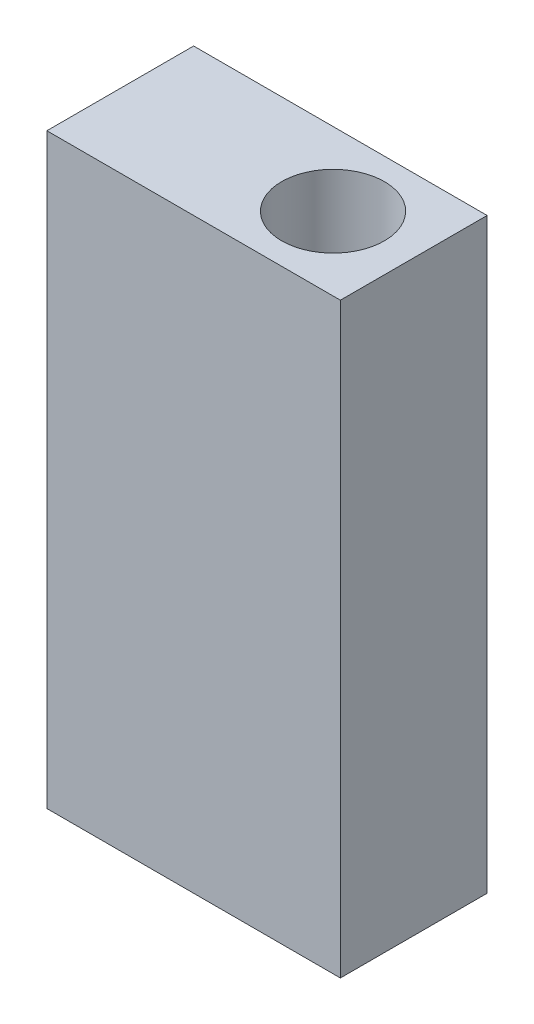
ISO-10303-21;
HEADER;
FILE_DESCRIPTION(('STEP AP214'),'2;1');
FILE_NAME('part.step','',(''),(''),'','','');
FILE_SCHEMA(('AUTOMOTIVE_DESIGN { 1 0 10303 214 1 1 1 1 }'));
ENDSEC;
DATA;
#1=APPLICATION_CONTEXT('core data for automotive mechanical design processes');
#2=APPLICATION_PROTOCOL_DEFINITION('international standard','automotive_design',2000,#1);
#3=PRODUCT_CONTEXT('',#1,'mechanical');
#4=PRODUCT('Part','Part','',(#3));
#5=PRODUCT_RELATED_PRODUCT_CATEGORY('part','',(#4));
#6=PRODUCT_DEFINITION_FORMATION('','',#4);
#7=PRODUCT_DEFINITION_CONTEXT('part definition',#1,'design');
#8=PRODUCT_DEFINITION('design','',#6,#7);
#9=PRODUCT_DEFINITION_SHAPE('','',#8);
#10=(LENGTH_UNIT() NAMED_UNIT(*) SI_UNIT(.MILLI.,.METRE.));
#11=(NAMED_UNIT(*) PLANE_ANGLE_UNIT() SI_UNIT($,.RADIAN.));
#12=(NAMED_UNIT(*) SI_UNIT($,.STERADIAN.) SOLID_ANGLE_UNIT());
#13=UNCERTAINTY_MEASURE_WITH_UNIT(LENGTH_MEASURE(1.E-05),#10,'distance_accuracy_value','');
#14=(GEOMETRIC_REPRESENTATION_CONTEXT(3) GLOBAL_UNCERTAINTY_ASSIGNED_CONTEXT((#13)) GLOBAL_UNIT_ASSIGNED_CONTEXT((#10,
#11,#12)) REPRESENTATION_CONTEXT('',''));
#15=CARTESIAN_POINT('',(0.,0.,0.));
#16=DIRECTION('',(0.,0.,1.));
#17=DIRECTION('',(1.,0.,0.));
#18=AXIS2_PLACEMENT_3D('',#15,#16,#17);
#19=CARTESIAN_POINT('',(0.,40.,0.));
#20=DIRECTION('',(0.,-1.,0.));
#21=DIRECTION('',(0.,0.,-1.));
#22=AXIS2_PLACEMENT_3D('',#19,#20,#21);
#23=PLANE('',#22);
#24=DIRECTION('',(0.,0.,1.));
#25=VECTOR('',#24,1.);
#26=CARTESIAN_POINT('',(-10.,40.,-5.));
#27=LINE('',#26,#25);
#28=CARTESIAN_POINT('',(-10.,40.,-5.));
#29=VERTEX_POINT('',#28);
#30=CARTESIAN_POINT('',(-10.,40.,5.));
#31=VERTEX_POINT('',#30);
#32=EDGE_CURVE('E86',#29,#31,#27,.T.);
#33=ORIENTED_EDGE('',*,*,#32,.T.);
#34=DIRECTION('',(1.,0.,0.));
#35=VECTOR('',#34,1.);
#36=CARTESIAN_POINT('',(10.,40.,5.));
#37=LINE('',#36,#35);
#38=CARTESIAN_POINT('',(10.,40.,5.));
#39=VERTEX_POINT('',#38);
#40=EDGE_CURVE('E81',#31,#39,#37,.T.);
#41=ORIENTED_EDGE('',*,*,#40,.T.);
#42=DIRECTION('',(0.,0.,-1.));
#43=VECTOR('',#42,1.);
#44=CARTESIAN_POINT('',(10.,40.,-5.));
#45=LINE('',#44,#43);
#46=CARTESIAN_POINT('',(10.,40.,-5.));
#47=VERTEX_POINT('',#46);
#48=EDGE_CURVE('E84',#39,#47,#45,.T.);
#49=ORIENTED_EDGE('',*,*,#48,.T.);
#50=DIRECTION('',(-1.,0.,0.));
#51=VECTOR('',#50,1.);
#52=CARTESIAN_POINT('',(10.,40.,-5.));
#53=LINE('',#52,#51);
#54=EDGE_CURVE('E50',#47,#29,#53,.T.);
#55=ORIENTED_EDGE('',*,*,#54,.T.);
#56=EDGE_LOOP('',(#33,#41,#49,#55));
#57=FACE_BOUND('',#56,.T.);
#58=CARTESIAN_POINT('',(4.5,40.,0.));
#59=DIRECTION('',(0.,1.,0.));
#60=DIRECTION('',(0.,0.,1.));
#61=AXIS2_PLACEMENT_3D('',#58,#59,#60);
#62=CIRCLE('',#61,3.5);
#63=CARTESIAN_POINT('',(4.5,40.,3.5));
#64=VERTEX_POINT('',#63);
#65=EDGE_CURVE('E103',#64,#64,#62,.T.);
#66=ORIENTED_EDGE('',*,*,#65,.F.);
#67=EDGE_LOOP('',(#66));
#68=FACE_BOUND('',#67,.T.);
#69=ADVANCED_FACE('F33',(#57,#68),#23,.F.);
#70=CARTESIAN_POINT('',(0.,0.,0.));
#71=DIRECTION('',(0.,-1.,0.));
#72=DIRECTION('',(0.,0.,-1.));
#73=AXIS2_PLACEMENT_3D('',#70,#71,#72);
#74=PLANE('',#73);
#75=DIRECTION('',(0.,0.,1.));
#76=VECTOR('',#75,1.);
#77=CARTESIAN_POINT('',(-10.,0.,-5.));
#78=LINE('',#77,#76);
#79=CARTESIAN_POINT('',(-10.,0.,-5.));
#80=VERTEX_POINT('',#79);
#81=CARTESIAN_POINT('',(-10.,0.,5.));
#82=VERTEX_POINT('',#81);
#83=EDGE_CURVE('E100',#80,#82,#78,.T.);
#84=ORIENTED_EDGE('',*,*,#83,.F.);
#85=DIRECTION('',(-1.,0.,0.));
#86=VECTOR('',#85,1.);
#87=CARTESIAN_POINT('',(10.,0.,-5.));
#88=LINE('',#87,#86);
#89=CARTESIAN_POINT('',(10.,0.,-5.));
#90=VERTEX_POINT('',#89);
#91=EDGE_CURVE('E73',#90,#80,#88,.T.);
#92=ORIENTED_EDGE('',*,*,#91,.F.);
#93=DIRECTION('',(0.,0.,-1.));
#94=VECTOR('',#93,1.);
#95=CARTESIAN_POINT('',(10.,0.,-5.));
#96=LINE('',#95,#94);
#97=CARTESIAN_POINT('',(10.,0.,5.));
#98=VERTEX_POINT('',#97);
#99=EDGE_CURVE('E67',#98,#90,#96,.T.);
#100=ORIENTED_EDGE('',*,*,#99,.F.);
#101=DIRECTION('',(1.,0.,0.));
#102=VECTOR('',#101,1.);
#103=CARTESIAN_POINT('',(10.,0.,5.));
#104=LINE('',#103,#102);
#105=EDGE_CURVE('E91',#82,#98,#104,.T.);
#106=ORIENTED_EDGE('',*,*,#105,.F.);
#107=EDGE_LOOP('',(#84,#92,#100,#106));
#108=FACE_BOUND('',#107,.T.);
#109=ADVANCED_FACE('F111',(#108),#74,.T.);
#110=CARTESIAN_POINT('',(-10.,40.,-5.));
#111=DIRECTION('',(1.,0.,0.));
#112=DIRECTION('',(0.,0.,-1.));
#113=AXIS2_PLACEMENT_3D('',#110,#111,#112);
#114=PLANE('',#113);
#115=ORIENTED_EDGE('',*,*,#83,.T.);
#116=DIRECTION('',(0.,-1.,0.));
#117=VECTOR('',#116,1.);
#118=CARTESIAN_POINT('',(-10.,40.,5.));
#119=LINE('',#118,#117);
#120=EDGE_CURVE('E42',#31,#82,#119,.T.);
#121=ORIENTED_EDGE('',*,*,#120,.F.);
#122=ORIENTED_EDGE('',*,*,#32,.F.);
#123=DIRECTION('',(0.,-1.,0.));
#124=VECTOR('',#123,1.);
#125=CARTESIAN_POINT('',(-10.,40.,-5.));
#126=LINE('',#125,#124);
#127=EDGE_CURVE('E96',#29,#80,#126,.T.);
#128=ORIENTED_EDGE('',*,*,#127,.T.);
#129=EDGE_LOOP('',(#115,#121,#122,#128));
#130=FACE_BOUND('',#129,.T.);
#131=ADVANCED_FACE('F35',(#130),#114,.F.);
#132=CARTESIAN_POINT('',(10.,40.,5.));
#133=DIRECTION('',(0.,0.,-1.));
#134=DIRECTION('',(-1.,0.,0.));
#135=AXIS2_PLACEMENT_3D('',#132,#133,#134);
#136=PLANE('',#135);
#137=ORIENTED_EDGE('',*,*,#105,.T.);
#138=DIRECTION('',(0.,-1.,0.));
#139=VECTOR('',#138,1.);
#140=CARTESIAN_POINT('',(10.,40.,5.));
#141=LINE('',#140,#139);
#142=EDGE_CURVE('E89',#39,#98,#141,.T.);
#143=ORIENTED_EDGE('',*,*,#142,.F.);
#144=ORIENTED_EDGE('',*,*,#40,.F.);
#145=ORIENTED_EDGE('',*,*,#120,.T.);
#146=EDGE_LOOP('',(#137,#143,#144,#145));
#147=FACE_BOUND('',#146,.T.);
#148=ADVANCED_FACE('F90',(#147),#136,.F.);
#149=CARTESIAN_POINT('',(10.,40.,-5.));
#150=DIRECTION('',(-1.,0.,0.));
#151=DIRECTION('',(0.,0.,1.));
#152=AXIS2_PLACEMENT_3D('',#149,#150,#151);
#153=PLANE('',#152);
#154=ORIENTED_EDGE('',*,*,#99,.T.);
#155=DIRECTION('',(0.,-1.,0.));
#156=VECTOR('',#155,1.);
#157=CARTESIAN_POINT('',(10.,40.,-5.));
#158=LINE('',#157,#156);
#159=EDGE_CURVE('E92',#47,#90,#158,.T.);
#160=ORIENTED_EDGE('',*,*,#159,.F.);
#161=ORIENTED_EDGE('',*,*,#48,.F.);
#162=ORIENTED_EDGE('',*,*,#142,.T.);
#163=EDGE_LOOP('',(#154,#160,#161,#162));
#164=FACE_BOUND('',#163,.T.);
#165=ADVANCED_FACE('F94',(#164),#153,.F.);
#166=CARTESIAN_POINT('',(10.,40.,-5.));
#167=DIRECTION('',(0.,0.,1.));
#168=DIRECTION('',(1.,0.,0.));
#169=AXIS2_PLACEMENT_3D('',#166,#167,#168);
#170=PLANE('',#169);
#171=ORIENTED_EDGE('',*,*,#91,.T.);
#172=ORIENTED_EDGE('',*,*,#127,.F.);
#173=ORIENTED_EDGE('',*,*,#54,.F.);
#174=ORIENTED_EDGE('',*,*,#159,.T.);
#175=EDGE_LOOP('',(#171,#172,#173,#174));
#176=FACE_BOUND('',#175,.T.);
#177=ADVANCED_FACE('F121',(#176),#170,.F.);
#178=CARTESIAN_POINT('',(4.5,40.,0.));
#179=DIRECTION('',(0.,-1.,0.));
#180=DIRECTION('',(0.,0.,-1.));
#181=AXIS2_PLACEMENT_3D('',#178,#179,#180);
#182=CYLINDRICAL_SURFACE('',#181,3.5);
#183=CARTESIAN_POINT('',(4.5,10.,0.));
#184=DIRECTION('',(0.,1.,0.));
#185=DIRECTION('',(0.,0.,1.));
#186=AXIS2_PLACEMENT_3D('',#183,#184,#185);
#187=CIRCLE('',#186,3.5);
#188=CARTESIAN_POINT('',(4.5,10.,3.5));
#189=VERTEX_POINT('',#188);
#190=EDGE_CURVE('E11',#189,#189,#187,.T.);
#191=ORIENTED_EDGE('',*,*,#190,.F.);
#192=EDGE_LOOP('',(#191));
#193=FACE_BOUND('',#192,.T.);
#194=ORIENTED_EDGE('',*,*,#65,.T.);
#195=EDGE_LOOP('',(#194));
#196=FACE_BOUND('',#195,.T.);
#197=ADVANCED_FACE('F124',(#193,#196),#182,.F.);
#198=CARTESIAN_POINT('',(4.5,10.,0.));
#199=DIRECTION('',(0.,1.,0.));
#200=DIRECTION('',(0.,0.,1.));
#201=AXIS2_PLACEMENT_3D('',#198,#199,#200);
#202=PLANE('',#201);
#203=ORIENTED_EDGE('',*,*,#190,.T.);
#204=EDGE_LOOP('',(#203));
#205=FACE_BOUND('',#204,.T.);
#206=ADVANCED_FACE('F145',(#205),#202,.T.);
#207=CLOSED_SHELL('',(#69,#109,#131,#148,#165,#177,#197,#206));
#208=MANIFOLD_SOLID_BREP('B2',#207);
#209=ADVANCED_BREP_SHAPE_REPRESENTATION('',(#18,#208),#14);
#210=SHAPE_DEFINITION_REPRESENTATION(#9,#209);
ENDSEC;
END-ISO-10303-21;
